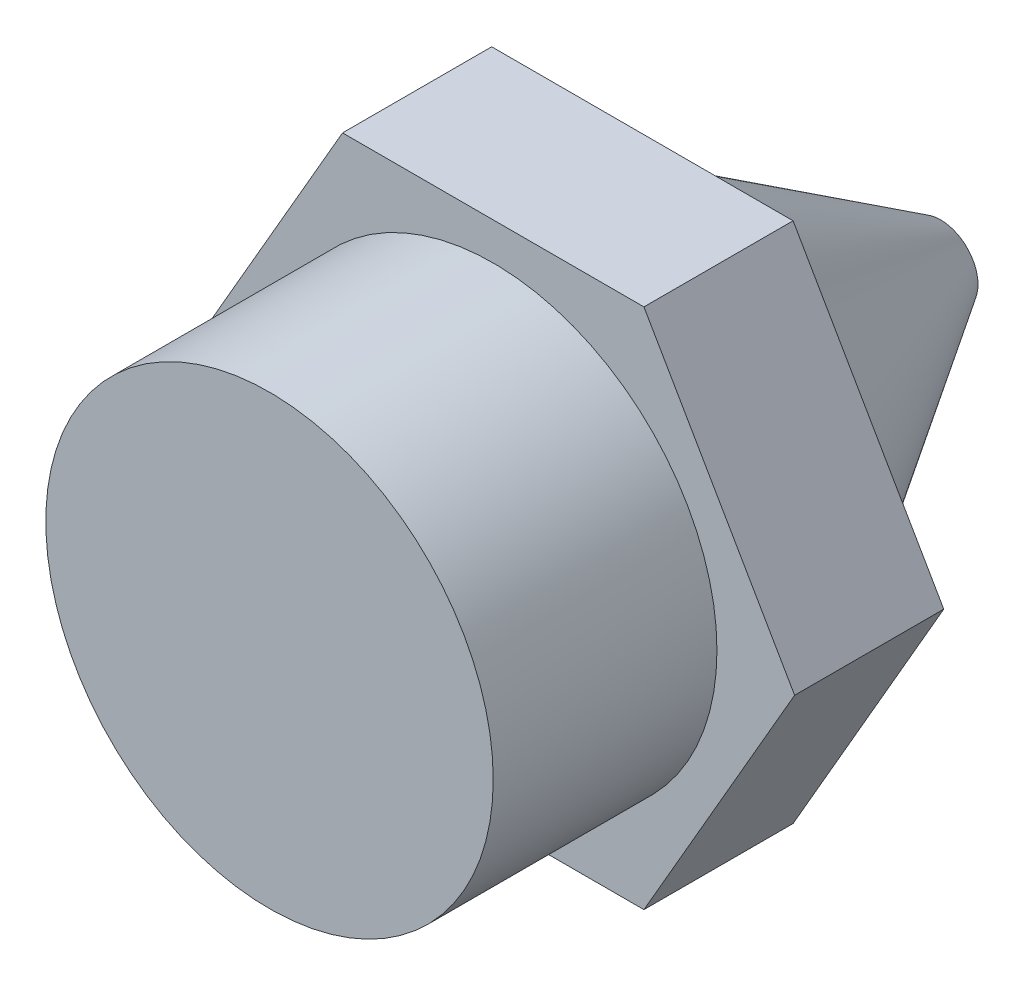
ISO-10303-21;
HEADER;
FILE_DESCRIPTION(('STEP AP214'),'2;1');
FILE_NAME('part.step','',(''),(''),'','','');
FILE_SCHEMA(('AUTOMOTIVE_DESIGN { 1 0 10303 214 1 1 1 1 }'));
ENDSEC;
DATA;
#1=APPLICATION_CONTEXT('core data for automotive mechanical design processes');
#2=APPLICATION_PROTOCOL_DEFINITION('international standard','automotive_design',2000,#1);
#3=PRODUCT_CONTEXT('',#1,'mechanical');
#4=PRODUCT('Part','Part','',(#3));
#5=PRODUCT_RELATED_PRODUCT_CATEGORY('part','',(#4));
#6=PRODUCT_DEFINITION_FORMATION('','',#4);
#7=PRODUCT_DEFINITION_CONTEXT('part definition',#1,'design');
#8=PRODUCT_DEFINITION('design','',#6,#7);
#9=PRODUCT_DEFINITION_SHAPE('','',#8);
#10=(LENGTH_UNIT() NAMED_UNIT(*) SI_UNIT(.MILLI.,.METRE.));
#11=(NAMED_UNIT(*) PLANE_ANGLE_UNIT() SI_UNIT($,.RADIAN.));
#12=(NAMED_UNIT(*) SI_UNIT($,.STERADIAN.) SOLID_ANGLE_UNIT());
#13=UNCERTAINTY_MEASURE_WITH_UNIT(LENGTH_MEASURE(1.E-05),#10,'distance_accuracy_value','');
#14=(GEOMETRIC_REPRESENTATION_CONTEXT(3) GLOBAL_UNCERTAINTY_ASSIGNED_CONTEXT((#13)) GLOBAL_UNIT_ASSIGNED_CONTEXT((#10,
#11,#12)) REPRESENTATION_CONTEXT('',''));
#15=CARTESIAN_POINT('',(0.,0.,0.));
#16=DIRECTION('',(0.,0.,1.));
#17=DIRECTION('',(1.,0.,0.));
#18=AXIS2_PLACEMENT_3D('',#15,#16,#17);
#19=CARTESIAN_POINT('',(2.02072594216368,3.50000000000001,9.));
#20=DIRECTION('',(0.,-1.,0.));
#21=DIRECTION('',(1.,0.,0.));
#22=AXIS2_PLACEMENT_3D('',#19,#20,#21);
#23=PLANE('',#22);
#24=DIRECTION('',(1.,0.,0.));
#25=VECTOR('',#24,1.);
#26=CARTESIAN_POINT('',(2.02072594216368,3.50000000000001,4.));
#27=LINE('',#26,#25);
#28=CARTESIAN_POINT('',(-2.02072594216371,3.49999999999999,4.));
#29=VERTEX_POINT('',#28);
#30=CARTESIAN_POINT('',(2.02072594216368,3.50000000000001,4.));
#31=VERTEX_POINT('',#30);
#32=EDGE_CURVE('E50',#29,#31,#27,.T.);
#33=ORIENTED_EDGE('',*,*,#32,.F.);
#34=DIRECTION('',(0.,0.,-1.));
#35=VECTOR('',#34,1.);
#36=CARTESIAN_POINT('',(-2.02072594216371,3.49999999999999,9.));
#37=LINE('',#36,#35);
#38=CARTESIAN_POINT('',(-2.02072594216371,3.49999999999999,6.));
#39=VERTEX_POINT('',#38);
#40=EDGE_CURVE('E118',#39,#29,#37,.T.);
#41=ORIENTED_EDGE('',*,*,#40,.F.);
#42=DIRECTION('',(-1.,0.,0.));
#43=VECTOR('',#42,1.);
#44=CARTESIAN_POINT('',(2.02072594216368,3.50000000000001,6.));
#45=LINE('',#44,#43);
#46=CARTESIAN_POINT('',(2.02072594216368,3.50000000000001,6.));
#47=VERTEX_POINT('',#46);
#48=EDGE_CURVE('E109',#47,#39,#45,.T.);
#49=ORIENTED_EDGE('',*,*,#48,.F.);
#50=DIRECTION('',(0.,0.,-1.));
#51=VECTOR('',#50,1.);
#52=CARTESIAN_POINT('',(2.02072594216368,3.50000000000001,9.));
#53=LINE('',#52,#51);
#54=EDGE_CURVE('E105',#47,#31,#53,.T.);
#55=ORIENTED_EDGE('',*,*,#54,.T.);
#56=EDGE_LOOP('',(#33,#41,#49,#55));
#57=FACE_BOUND('',#56,.T.);
#58=ADVANCED_FACE('F35',(#57),#23,.F.);
#59=CARTESIAN_POINT('',(-2.02072594216371,3.49999999999999,9.));
#60=DIRECTION('',(0.866025403784441,-0.499999999999995,0.));
#61=DIRECTION('',(0.499999999999995,0.866025403784442,0.));
#62=AXIS2_PLACEMENT_3D('',#59,#60,#61);
#63=PLANE('',#62);
#64=DIRECTION('',(0.499999999999995,0.866025403784442,0.));
#65=VECTOR('',#64,1.);
#66=CARTESIAN_POINT('',(-2.02072594216371,3.49999999999999,4.));
#67=LINE('',#66,#65);
#68=CARTESIAN_POINT('',(-4.04145188432738,0.,4.));
#69=VERTEX_POINT('',#68);
#70=EDGE_CURVE('E141',#69,#29,#67,.T.);
#71=ORIENTED_EDGE('',*,*,#70,.F.);
#72=DIRECTION('',(0.,0.,-1.));
#73=VECTOR('',#72,1.);
#74=CARTESIAN_POINT('',(-4.04145188432738,0.,9.));
#75=LINE('',#74,#73);
#76=CARTESIAN_POINT('',(-4.04145188432738,0.,6.));
#77=VERTEX_POINT('',#76);
#78=EDGE_CURVE('E115',#77,#69,#75,.T.);
#79=ORIENTED_EDGE('',*,*,#78,.F.);
#80=DIRECTION('',(-0.499999999999995,-0.866025403784442,0.));
#81=VECTOR('',#80,1.);
#82=CARTESIAN_POINT('',(-2.02072594216371,3.49999999999999,6.));
#83=LINE('',#82,#81);
#84=EDGE_CURVE('E126',#39,#77,#83,.T.);
#85=ORIENTED_EDGE('',*,*,#84,.F.);
#86=ORIENTED_EDGE('',*,*,#40,.T.);
#87=EDGE_LOOP('',(#71,#79,#85,#86));
#88=FACE_BOUND('',#87,.T.);
#89=ADVANCED_FACE('F166',(#88),#63,.F.);
#90=CARTESIAN_POINT('',(-4.04145188432738,0.,9.));
#91=DIRECTION('',(0.866025403784434,0.500000000000007,0.));
#92=DIRECTION('',(-0.500000000000007,0.866025403784435,0.));
#93=AXIS2_PLACEMENT_3D('',#90,#91,#92);
#94=PLANE('',#93);
#95=DIRECTION('',(-0.500000000000007,0.866025403784435,0.));
#96=VECTOR('',#95,1.);
#97=CARTESIAN_POINT('',(-4.04145188432738,0.,4.));
#98=LINE('',#97,#96);
#99=CARTESIAN_POINT('',(-2.02072594216366,-3.50000000000002,4.));
#100=VERTEX_POINT('',#99);
#101=EDGE_CURVE('E143',#100,#69,#98,.T.);
#102=ORIENTED_EDGE('',*,*,#101,.F.);
#103=DIRECTION('',(0.,0.,-1.));
#104=VECTOR('',#103,1.);
#105=CARTESIAN_POINT('',(-2.02072594216366,-3.50000000000002,9.));
#106=LINE('',#105,#104);
#107=CARTESIAN_POINT('',(-2.02072594216366,-3.50000000000002,6.));
#108=VERTEX_POINT('',#107);
#109=EDGE_CURVE('E107',#108,#100,#106,.T.);
#110=ORIENTED_EDGE('',*,*,#109,.F.);
#111=DIRECTION('',(0.500000000000007,-0.866025403784435,0.));
#112=VECTOR('',#111,1.);
#113=CARTESIAN_POINT('',(-4.04145188432738,0.,6.));
#114=LINE('',#113,#112);
#115=EDGE_CURVE('E127',#77,#108,#114,.T.);
#116=ORIENTED_EDGE('',*,*,#115,.F.);
#117=ORIENTED_EDGE('',*,*,#78,.T.);
#118=EDGE_LOOP('',(#102,#110,#116,#117));
#119=FACE_BOUND('',#118,.T.);
#120=ADVANCED_FACE('F170',(#119),#94,.F.);
#121=CARTESIAN_POINT('',(-2.02072594216366,-3.50000000000002,9.));
#122=DIRECTION('',(0.,1.,0.));
#123=DIRECTION('',(-1.,0.,0.));
#124=AXIS2_PLACEMENT_3D('',#121,#122,#123);
#125=PLANE('',#124);
#126=DIRECTION('',(-1.,0.,0.));
#127=VECTOR('',#126,1.);
#128=CARTESIAN_POINT('',(-2.02072594216366,-3.50000000000002,4.));
#129=LINE('',#128,#127);
#130=CARTESIAN_POINT('',(2.02072594216373,-3.49999999999998,4.));
#131=VERTEX_POINT('',#130);
#132=EDGE_CURVE('E101',#131,#100,#129,.T.);
#133=ORIENTED_EDGE('',*,*,#132,.F.);
#134=DIRECTION('',(0.,0.,-1.));
#135=VECTOR('',#134,1.);
#136=CARTESIAN_POINT('',(2.02072594216373,-3.49999999999998,9.));
#137=LINE('',#136,#135);
#138=CARTESIAN_POINT('',(2.02072594216373,-3.49999999999998,6.));
#139=VERTEX_POINT('',#138);
#140=EDGE_CURVE('E100',#139,#131,#137,.T.);
#141=ORIENTED_EDGE('',*,*,#140,.F.);
#142=DIRECTION('',(1.,0.,0.));
#143=VECTOR('',#142,1.);
#144=CARTESIAN_POINT('',(-2.02072594216366,-3.50000000000002,6.));
#145=LINE('',#144,#143);
#146=EDGE_CURVE('E131',#108,#139,#145,.T.);
#147=ORIENTED_EDGE('',*,*,#146,.F.);
#148=ORIENTED_EDGE('',*,*,#109,.T.);
#149=EDGE_LOOP('',(#133,#141,#147,#148));
#150=FACE_BOUND('',#149,.T.);
#151=ADVANCED_FACE('F176',(#150),#125,.F.);
#152=CARTESIAN_POINT('',(2.02072594216373,-3.49999999999998,9.));
#153=DIRECTION('',(-0.866025403784442,0.499999999999995,0.));
#154=DIRECTION('',(-0.499999999999995,-0.866025403784442,0.));
#155=AXIS2_PLACEMENT_3D('',#152,#153,#154);
#156=PLANE('',#155);
#157=DIRECTION('',(-0.499999999999995,-0.866025403784442,0.));
#158=VECTOR('',#157,1.);
#159=CARTESIAN_POINT('',(2.02072594216373,-3.49999999999998,4.));
#160=LINE('',#159,#158);
#161=CARTESIAN_POINT('',(4.04145188432738,0.,4.));
#162=VERTEX_POINT('',#161);
#163=EDGE_CURVE('E87',#162,#131,#160,.T.);
#164=ORIENTED_EDGE('',*,*,#163,.F.);
#165=DIRECTION('',(0.,0.,-1.));
#166=VECTOR('',#165,1.);
#167=CARTESIAN_POINT('',(4.04145188432738,0.,9.));
#168=LINE('',#167,#166);
#169=CARTESIAN_POINT('',(4.04145188432738,0.,6.));
#170=VERTEX_POINT('',#169);
#171=EDGE_CURVE('E98',#170,#162,#168,.T.);
#172=ORIENTED_EDGE('',*,*,#171,.F.);
#173=DIRECTION('',(0.499999999999995,0.866025403784442,0.));
#174=VECTOR('',#173,1.);
#175=CARTESIAN_POINT('',(2.02072594216373,-3.49999999999998,6.));
#176=LINE('',#175,#174);
#177=EDGE_CURVE('E58',#139,#170,#176,.T.);
#178=ORIENTED_EDGE('',*,*,#177,.F.);
#179=ORIENTED_EDGE('',*,*,#140,.T.);
#180=EDGE_LOOP('',(#164,#172,#178,#179));
#181=FACE_BOUND('',#180,.T.);
#182=ADVANCED_FACE('F97',(#181),#156,.F.);
#183=CARTESIAN_POINT('',(4.04145188432738,0.,9.));
#184=DIRECTION('',(-0.866025403784438,-0.500000000000001,0.));
#185=DIRECTION('',(0.500000000000001,-0.866025403784438,0.));
#186=AXIS2_PLACEMENT_3D('',#183,#184,#185);
#187=PLANE('',#186);
#188=DIRECTION('',(0.500000000000001,-0.866025403784438,0.));
#189=VECTOR('',#188,1.);
#190=CARTESIAN_POINT('',(4.04145188432738,0.,4.));
#191=LINE('',#190,#189);
#192=EDGE_CURVE('E43',#31,#162,#191,.T.);
#193=ORIENTED_EDGE('',*,*,#192,.F.);
#194=ORIENTED_EDGE('',*,*,#54,.F.);
#195=DIRECTION('',(-0.500000000000001,0.866025403784438,0.));
#196=VECTOR('',#195,1.);
#197=CARTESIAN_POINT('',(4.04145188432738,0.,6.));
#198=LINE('',#197,#196);
#199=EDGE_CURVE('E93',#170,#47,#198,.T.);
#200=ORIENTED_EDGE('',*,*,#199,.F.);
#201=ORIENTED_EDGE('',*,*,#171,.T.);
#202=EDGE_LOOP('',(#193,#194,#200,#201));
#203=FACE_BOUND('',#202,.T.);
#204=ADVANCED_FACE('F104',(#203),#187,.F.);
#205=CARTESIAN_POINT('',(0.,0.,6.));
#206=DIRECTION('',(0.,0.,1.));
#207=DIRECTION('',(1.,0.,0.));
#208=AXIS2_PLACEMENT_3D('',#205,#206,#207);
#209=PLANE('',#208);
#210=CARTESIAN_POINT('',(0.,0.,6.));
#211=DIRECTION('',(0.,0.,1.));
#212=DIRECTION('',(1.,0.,0.));
#213=AXIS2_PLACEMENT_3D('',#210,#211,#212);
#214=CIRCLE('',#213,3.);
#215=CARTESIAN_POINT('',(3.,0.,6.));
#216=VERTEX_POINT('',#215);
#217=EDGE_CURVE('E134',#216,#216,#214,.T.);
#218=ORIENTED_EDGE('',*,*,#217,.F.);
#219=EDGE_LOOP('',(#218));
#220=FACE_BOUND('',#219,.T.);
#221=ORIENTED_EDGE('',*,*,#48,.T.);
#222=ORIENTED_EDGE('',*,*,#84,.T.);
#223=ORIENTED_EDGE('',*,*,#115,.T.);
#224=ORIENTED_EDGE('',*,*,#146,.T.);
#225=ORIENTED_EDGE('',*,*,#177,.T.);
#226=ORIENTED_EDGE('',*,*,#199,.T.);
#227=EDGE_LOOP('',(#221,#222,#223,#224,#225,#226));
#228=FACE_BOUND('',#227,.T.);
#229=ADVANCED_FACE('F122',(#220,#228),#209,.T.);
#230=CARTESIAN_POINT('',(0.,0.,6.));
#231=DIRECTION('',(0.,0.,1.));
#232=DIRECTION('',(1.,0.,0.));
#233=AXIS2_PLACEMENT_3D('',#230,#231,#232);
#234=CYLINDRICAL_SURFACE('',#233,3.);
#235=ORIENTED_EDGE('',*,*,#217,.T.);
#236=EDGE_LOOP('',(#235));
#237=FACE_BOUND('',#236,.T.);
#238=CARTESIAN_POINT('',(0.,0.,9.));
#239=DIRECTION('',(0.,0.,1.));
#240=DIRECTION('',(1.,0.,0.));
#241=AXIS2_PLACEMENT_3D('',#238,#239,#240);
#242=CIRCLE('',#241,3.);
#243=CARTESIAN_POINT('',(3.,0.,9.));
#244=VERTEX_POINT('',#243);
#245=EDGE_CURVE('E135',#244,#244,#242,.T.);
#246=ORIENTED_EDGE('',*,*,#245,.F.);
#247=EDGE_LOOP('',(#246));
#248=FACE_BOUND('',#247,.T.);
#249=ADVANCED_FACE('F161',(#237,#248),#234,.T.);
#250=CARTESIAN_POINT('',(0.,0.,9.));
#251=DIRECTION('',(0.,0.,1.));
#252=DIRECTION('',(1.,0.,0.));
#253=AXIS2_PLACEMENT_3D('',#250,#251,#252);
#254=PLANE('',#253);
#255=ORIENTED_EDGE('',*,*,#245,.T.);
#256=EDGE_LOOP('',(#255));
#257=FACE_BOUND('',#256,.T.);
#258=ADVANCED_FACE('F153',(#257),#254,.T.);
#259=CARTESIAN_POINT('',(0.,0.,4.));
#260=DIRECTION('',(0.,0.,-1.));
#261=DIRECTION('',(-1.,0.,0.));
#262=AXIS2_PLACEMENT_3D('',#259,#260,#261);
#263=PLANE('',#262);
#264=CARTESIAN_POINT('',(0.,0.,4.));
#265=DIRECTION('',(0.,0.,-1.));
#266=DIRECTION('',(-1.,0.,0.));
#267=AXIS2_PLACEMENT_3D('',#264,#265,#266);
#268=CIRCLE('',#267,3.);
#269=CARTESIAN_POINT('',(2.99999999999998,0.,4.));
#270=VERTEX_POINT('',#269);
#271=EDGE_CURVE('E102',#270,#270,#268,.T.);
#272=ORIENTED_EDGE('',*,*,#271,.F.);
#273=EDGE_LOOP('',(#272));
#274=FACE_BOUND('',#273,.T.);
#275=ORIENTED_EDGE('',*,*,#32,.T.);
#276=ORIENTED_EDGE('',*,*,#192,.T.);
#277=ORIENTED_EDGE('',*,*,#163,.T.);
#278=ORIENTED_EDGE('',*,*,#132,.T.);
#279=ORIENTED_EDGE('',*,*,#101,.T.);
#280=ORIENTED_EDGE('',*,*,#70,.T.);
#281=EDGE_LOOP('',(#275,#276,#277,#278,#279,#280));
#282=FACE_BOUND('',#281,.T.);
#283=ADVANCED_FACE('F86',(#274,#282),#263,.T.);
#284=CARTESIAN_POINT('',(0.,0.,0.));
#285=DIRECTION('',(0.,0.,1.));
#286=DIRECTION('',(1.,0.,0.));
#287=AXIS2_PLACEMENT_3D('',#284,#285,#286);
#288=PLANE('',#287);
#289=CARTESIAN_POINT('',(0.,0.,0.));
#290=DIRECTION('',(0.,0.,1.));
#291=DIRECTION('',(1.,0.,0.));
#292=AXIS2_PLACEMENT_3D('',#289,#290,#291);
#293=CIRCLE('',#292,0.500522592362688);
#294=CARTESIAN_POINT('',(0.500522592362688,0.,0.));
#295=VERTEX_POINT('',#294);
#296=EDGE_CURVE('E11',#295,#295,#293,.F.);
#297=ORIENTED_EDGE('',*,*,#296,.T.);
#298=EDGE_LOOP('',(#297));
#299=FACE_BOUND('',#298,.T.);
#300=ADVANCED_FACE('F152',(#299),#288,.F.);
#301=CARTESIAN_POINT('',(0.,0.,0.));
#302=DIRECTION('',(0.,0.,1.));
#303=DIRECTION('',(1.,0.,0.));
#304=AXIS2_PLACEMENT_3D('',#301,#302,#303);
#305=CONICAL_SURFACE('',#304,0.500522592362688,0.558505360638183);
#306=CARTESIAN_POINT('',(2.99999999999998,0.,4.));
#307=CARTESIAN_POINT('',(2.97396377700376,0.,3.95833333333333));
#308=CARTESIAN_POINT('',(2.94792755400754,0.,3.91666666666667));
#309=CARTESIAN_POINT('',(2.8958551080151,0.,3.83333333333333));
#310=CARTESIAN_POINT('',(2.86981888501887,0.,3.79166666666667));
#311=CARTESIAN_POINT('',(2.81774643902643,0.,3.70833333333333));
#312=CARTESIAN_POINT('',(2.79171021603021,0.,3.66666666666667));
#313=CARTESIAN_POINT('',(2.73963777003777,0.,3.58333333333333));
#314=CARTESIAN_POINT('',(2.71360154704154,0.,3.54166666666667));
#315=CARTESIAN_POINT('',(2.6615291010491,0.,3.45833333333333));
#316=CARTESIAN_POINT('',(2.63549287805288,0.,3.41666666666667));
#317=CARTESIAN_POINT('',(2.58342043206043,0.,3.33333333333333));
#318=CARTESIAN_POINT('',(2.55738420906421,0.,3.29166666666667));
#319=CARTESIAN_POINT('',(2.50531176307177,0.,3.20833333333333));
#320=CARTESIAN_POINT('',(2.47927554007555,0.,3.16666666666667));
#321=CARTESIAN_POINT('',(2.4272030940831,0.,3.08333333333333));
#322=CARTESIAN_POINT('',(2.40116687108688,0.,3.04166666666667));
#323=CARTESIAN_POINT('',(2.34909442509444,0.,2.95833333333333));
#324=CARTESIAN_POINT('',(2.32305820209822,0.,2.91666666666667));
#325=CARTESIAN_POINT('',(2.27098575610577,0.,2.83333333333333));
#326=CARTESIAN_POINT('',(2.24494953310955,0.,2.79166666666667));
#327=CARTESIAN_POINT('',(2.19287708711711,0.,2.70833333333333));
#328=CARTESIAN_POINT('',(2.16684086412088,0.,2.66666666666667));
#329=CARTESIAN_POINT('',(2.11476841812844,0.,2.58333333333333));
#330=CARTESIAN_POINT('',(2.08873219513222,0.,2.54166666666667));
#331=CARTESIAN_POINT('',(2.03665974913978,0.,2.45833333333333));
#332=CARTESIAN_POINT('',(2.01062352614355,0.,2.41666666666667));
#333=CARTESIAN_POINT('',(1.95855108015111,0.,2.33333333333333));
#334=CARTESIAN_POINT('',(1.93251485715489,0.,2.29166666666667));
#335=CARTESIAN_POINT('',(1.88044241116245,0.,2.20833333333333));
#336=CARTESIAN_POINT('',(1.85440618816622,0.,2.16666666666667));
#337=CARTESIAN_POINT('',(1.80233374217378,0.,2.08333333333333));
#338=CARTESIAN_POINT('',(1.77629751917756,0.,2.04166666666667));
#339=CARTESIAN_POINT('',(1.72422507318511,0.,1.95833333333333));
#340=CARTESIAN_POINT('',(1.69818885018889,0.,1.91666666666667));
#341=CARTESIAN_POINT('',(1.64611640419645,0.,1.83333333333333));
#342=CARTESIAN_POINT('',(1.62008018120023,0.,1.79166666666667));
#343=CARTESIAN_POINT('',(1.56800773520778,0.,1.70833333333333));
#344=CARTESIAN_POINT('',(1.54197151221156,0.,1.66666666666667));
#345=CARTESIAN_POINT('',(1.48989906621912,0.,1.58333333333333));
#346=CARTESIAN_POINT('',(1.4638628432229,0.,1.54166666666667));
#347=CARTESIAN_POINT('',(1.41179039723045,0.,1.45833333333333));
#348=CARTESIAN_POINT('',(1.38575417423423,0.,1.41666666666667));
#349=CARTESIAN_POINT('',(1.33368172824179,0.,1.33333333333333));
#350=CARTESIAN_POINT('',(1.30764550524556,0.,1.29166666666667));
#351=CARTESIAN_POINT('',(1.25557305925312,0.,1.20833333333333));
#352=CARTESIAN_POINT('',(1.2295368362569,0.,1.16666666666667));
#353=CARTESIAN_POINT('',(1.17746439026446,0.,1.08333333333333));
#354=CARTESIAN_POINT('',(1.15142816726823,0.,1.04166666666667));
#355=CARTESIAN_POINT('',(1.09935572127579,0.,0.958333333333333));
#356=CARTESIAN_POINT('',(1.07331949827957,0.,0.916666666666667));
#357=CARTESIAN_POINT('',(1.02124705228712,0.,0.833333333333333));
#358=CARTESIAN_POINT('',(0.995210829290903,0.,0.791666666666667));
#359=CARTESIAN_POINT('',(0.943138383298459,0.,0.708333333333333));
#360=CARTESIAN_POINT('',(0.917102160302237,0.,0.666666666666667));
#361=CARTESIAN_POINT('',(0.865029714309794,0.,0.583333333333333));
#362=CARTESIAN_POINT('',(0.838993491313572,0.,0.541666666666667));
#363=CARTESIAN_POINT('',(0.786921045321128,0.,0.458333333333333));
#364=CARTESIAN_POINT('',(0.760884822324907,0.,0.416666666666667));
#365=CARTESIAN_POINT('',(0.708812376332463,0.,0.333333333333333));
#366=CARTESIAN_POINT('',(0.682776153336241,0.,0.291666666666667));
#367=CARTESIAN_POINT('',(0.630703707343798,0.,0.208333333333333));
#368=CARTESIAN_POINT('',(0.604667484347576,0.,0.166666666666667));
#369=CARTESIAN_POINT('',(0.552595038355132,0.,0.0833333333333335));
#370=CARTESIAN_POINT('',(0.52655881535891,0.,0.0416666666666668));
#371=CARTESIAN_POINT('',(0.500522592362688,0.,0.));
#372=B_SPLINE_CURVE_WITH_KNOTS('',3,(#306,#307,#308,#309,#310,#311,#312,#313,#314,#315,#316,
#317,#318,#319,#320,#321,#322,#323,#324,#325,#326,#327,#328,#329,#330,#331,#332,#333,#334,#335,
#336,#337,#338,#339,#340,#341,#342,#343,#344,#345,#346,#347,#348,#349,#350,#351,#352,#353,#354,
#355,#356,#357,#358,#359,#360,#361,#362,#363,#364,#365,#366,#367,#368,#369,#370,#371),
.UNSPECIFIED.,.F.,.F.,(4,2,2,2,2,2,2,2,2,2,2,2,2,2,2,2,2,2,2,2,2,2,2,2,2,2,2,2,2,2,2,2,4),(0.,
0.147397300420262,0.294794600840524,0.442191901260785,0.589589201681047,0.736986502101309,
0.884383802521571,1.03178110294183,1.17917840336209,1.32657570378236,1.47397300420262,
1.62137030462288,1.76876760504314,1.9161649054634,2.06356220588366,2.21095950630393,
2.35835680672419,2.50575410714445,2.65315140756471,2.80054870798497,2.94794600840524,
3.0953433088255,3.24274060924576,3.39013790966602,3.53753521008628,3.68493251050655,
3.83232981092681,3.97972711134707,4.12712441176733,4.27452171218759,4.42191901260786,
4.56931631302812,4.71671361344838),.UNSPECIFIED.);
#373=EDGE_CURVE('BSEAM37',#270,#295,#372,.T.);
#374=ORIENTED_EDGE('',*,*,#271,.T.);
#375=ORIENTED_EDGE('',*,*,#296,.F.);
#376=ORIENTED_EDGE('',*,*,#373,.T.);
#377=ORIENTED_EDGE('',*,*,#373,.F.);
#378=EDGE_LOOP('',(#374,#376,#375,#377));
#379=FACE_BOUND('',#378,.T.);
#380=ADVANCED_FACE('F37',(#379),#305,.T.);
#381=CLOSED_SHELL('',(#58,#89,#120,#151,#182,#204,#229,#249,#258,#283,#300,#380));
#382=MANIFOLD_SOLID_BREP('B2',#381);
#383=ADVANCED_BREP_SHAPE_REPRESENTATION('',(#18,#382),#14);
#384=SHAPE_DEFINITION_REPRESENTATION(#9,#383);
ENDSEC;
END-ISO-10303-21;
